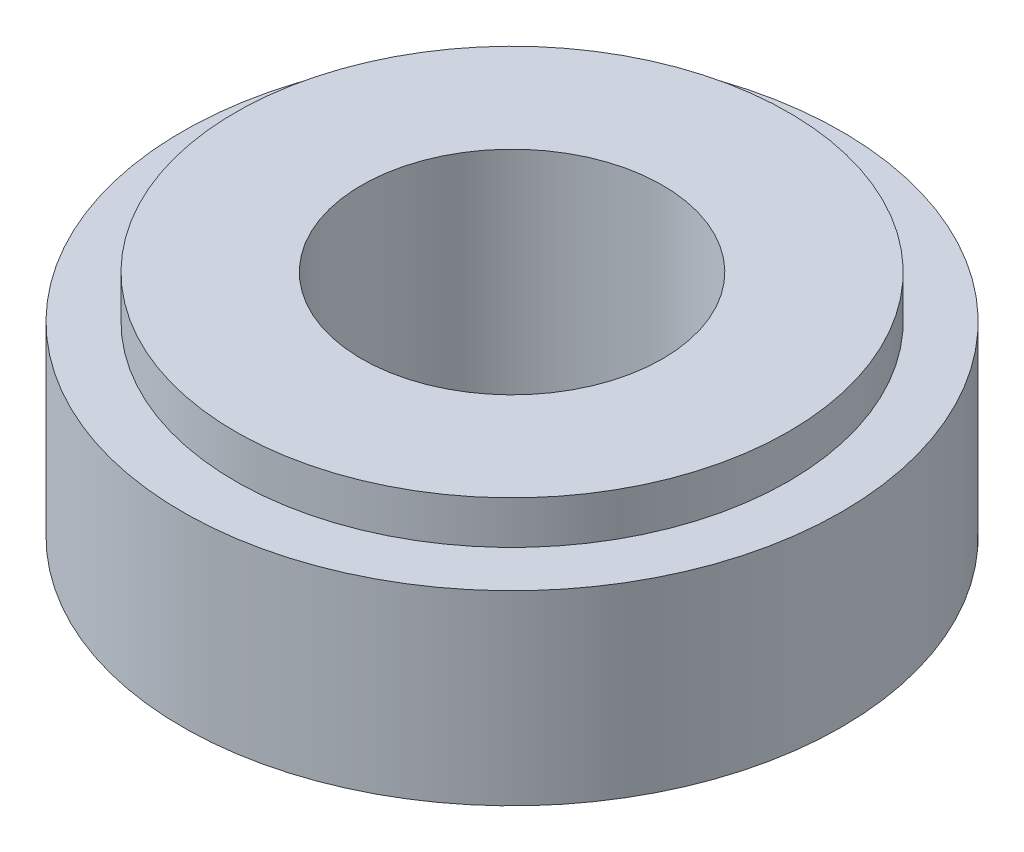
ISO-10303-21;
HEADER;
FILE_DESCRIPTION(('STEP AP214'),'2;1');
FILE_NAME('part.step','',(''),(''),'','','');
FILE_SCHEMA(('AUTOMOTIVE_DESIGN { 1 0 10303 214 1 1 1 1 }'));
ENDSEC;
DATA;
#1=APPLICATION_CONTEXT('core data for automotive mechanical design processes');
#2=APPLICATION_PROTOCOL_DEFINITION('international standard','automotive_design',2000,#1);
#3=PRODUCT_CONTEXT('',#1,'mechanical');
#4=PRODUCT('Part','Part','',(#3));
#5=PRODUCT_RELATED_PRODUCT_CATEGORY('part','',(#4));
#6=PRODUCT_DEFINITION_FORMATION('','',#4);
#7=PRODUCT_DEFINITION_CONTEXT('part definition',#1,'design');
#8=PRODUCT_DEFINITION('design','',#6,#7);
#9=PRODUCT_DEFINITION_SHAPE('','',#8);
#10=(LENGTH_UNIT() NAMED_UNIT(*) SI_UNIT(.MILLI.,.METRE.));
#11=(NAMED_UNIT(*) PLANE_ANGLE_UNIT() SI_UNIT($,.RADIAN.));
#12=(NAMED_UNIT(*) SI_UNIT($,.STERADIAN.) SOLID_ANGLE_UNIT());
#13=UNCERTAINTY_MEASURE_WITH_UNIT(LENGTH_MEASURE(1.E-05),#10,'distance_accuracy_value','');
#14=(GEOMETRIC_REPRESENTATION_CONTEXT(3) GLOBAL_UNCERTAINTY_ASSIGNED_CONTEXT((#13)) GLOBAL_UNIT_ASSIGNED_CONTEXT((#10,
#11,#12)) REPRESENTATION_CONTEXT('',''));
#15=CARTESIAN_POINT('',(0.,0.,0.));
#16=DIRECTION('',(0.,0.,1.));
#17=DIRECTION('',(1.,0.,0.));
#18=AXIS2_PLACEMENT_3D('',#15,#16,#17);
#19=CARTESIAN_POINT('',(4.34347941715535E-13,-126.622860864218,0.));
#20=DIRECTION('',(0.,-1.,0.));
#21=DIRECTION('',(1.,0.,0.));
#22=AXIS2_PLACEMENT_3D('',#19,#20,#21);
#23=CYLINDRICAL_SURFACE('',#22,5.74999999999999);
#24=CARTESIAN_POINT('',(0.,0.,0.));
#25=DIRECTION('',(0.,-1.,0.));
#26=DIRECTION('',(1.,0.,0.));
#27=AXIS2_PLACEMENT_3D('',#24,#25,#26);
#28=CIRCLE('',#27,5.75);
#29=CARTESIAN_POINT('',(5.75,0.,0.));
#30=VERTEX_POINT('',#29);
#31=EDGE_CURVE('E57',#30,#30,#28,.T.);
#32=ORIENTED_EDGE('',*,*,#31,.F.);
#33=EDGE_LOOP('',(#32));
#34=FACE_BOUND('',#33,.T.);
#35=CARTESIAN_POINT('',(0.,3.25000000000003,0.));
#36=DIRECTION('',(0.,-1.,0.));
#37=DIRECTION('',(1.,0.,0.));
#38=AXIS2_PLACEMENT_3D('',#35,#36,#37);
#39=CIRCLE('',#38,5.74999999999999);
#40=CARTESIAN_POINT('',(5.74999999999998,3.25000000000005,0.));
#41=VERTEX_POINT('',#40);
#42=EDGE_CURVE('E10',#41,#41,#39,.T.);
#43=ORIENTED_EDGE('',*,*,#42,.T.);
#44=EDGE_LOOP('',(#43));
#45=FACE_BOUND('',#44,.T.);
#46=ADVANCED_FACE('F35',(#34,#45),#23,.T.);
#47=CARTESIAN_POINT('',(-5.75,3.25,0.));
#48=DIRECTION('',(0.,-1.,0.));
#49=DIRECTION('',(1.,0.,0.));
#50=AXIS2_PLACEMENT_3D('',#47,#48,#49);
#51=PLANE('',#50);
#52=ORIENTED_EDGE('',*,*,#42,.F.);
#53=EDGE_LOOP('',(#52));
#54=FACE_BOUND('',#53,.T.);
#55=CARTESIAN_POINT('',(0.,3.25000000000003,0.));
#56=DIRECTION('',(0.,-1.,0.));
#57=DIRECTION('',(1.,0.,0.));
#58=AXIS2_PLACEMENT_3D('',#55,#56,#57);
#59=CIRCLE('',#58,4.82499999999999);
#60=CARTESIAN_POINT('',(4.82499999999998,3.25000000000005,0.));
#61=VERTEX_POINT('',#60);
#62=EDGE_CURVE('E41',#61,#61,#59,.T.);
#63=ORIENTED_EDGE('',*,*,#62,.T.);
#64=EDGE_LOOP('',(#63));
#65=FACE_BOUND('',#64,.T.);
#66=ADVANCED_FACE('F64',(#54,#65),#51,.F.);
#67=CARTESIAN_POINT('',(4.34347941715535E-13,-126.622860864218,0.));
#68=DIRECTION('',(0.,-1.,0.));
#69=DIRECTION('',(1.,0.,0.));
#70=AXIS2_PLACEMENT_3D('',#67,#68,#69);
#71=CYLINDRICAL_SURFACE('',#70,4.82499999999999);
#72=ORIENTED_EDGE('',*,*,#62,.F.);
#73=EDGE_LOOP('',(#72));
#74=FACE_BOUND('',#73,.T.);
#75=CARTESIAN_POINT('',(0.,4.00000000000003,0.));
#76=DIRECTION('',(0.,-1.,0.));
#77=DIRECTION('',(1.,0.,0.));
#78=AXIS2_PLACEMENT_3D('',#75,#76,#77);
#79=CIRCLE('',#78,4.82499999999999);
#80=CARTESIAN_POINT('',(4.82499999999997,4.00000000000005,0.));
#81=VERTEX_POINT('',#80);
#82=EDGE_CURVE('E45',#81,#81,#79,.T.);
#83=ORIENTED_EDGE('',*,*,#82,.T.);
#84=EDGE_LOOP('',(#83));
#85=FACE_BOUND('',#84,.T.);
#86=ADVANCED_FACE('F68',(#74,#85),#71,.T.);
#87=CARTESIAN_POINT('',(-4.825,4.,0.));
#88=DIRECTION('',(0.,-1.,0.));
#89=DIRECTION('',(1.,0.,0.));
#90=AXIS2_PLACEMENT_3D('',#87,#88,#89);
#91=PLANE('',#90);
#92=ORIENTED_EDGE('',*,*,#82,.F.);
#93=EDGE_LOOP('',(#92));
#94=FACE_BOUND('',#93,.T.);
#95=CARTESIAN_POINT('',(0.,4.,0.));
#96=DIRECTION('',(0.,-1.,0.));
#97=DIRECTION('',(1.,0.,0.));
#98=AXIS2_PLACEMENT_3D('',#95,#96,#97);
#99=CIRCLE('',#98,2.62499999999999);
#100=CARTESIAN_POINT('',(2.62499999999997,4.00000000000001,0.));
#101=VERTEX_POINT('',#100);
#102=EDGE_CURVE('E49',#101,#101,#99,.T.);
#103=ORIENTED_EDGE('',*,*,#102,.T.);
#104=EDGE_LOOP('',(#103));
#105=FACE_BOUND('',#104,.T.);
#106=ADVANCED_FACE('F73',(#94,#105),#91,.F.);
#107=CARTESIAN_POINT('',(4.34347941715535E-13,-126.622860864218,0.));
#108=DIRECTION('',(0.,-1.,0.));
#109=DIRECTION('',(1.,0.,0.));
#110=AXIS2_PLACEMENT_3D('',#107,#108,#109);
#111=CYLINDRICAL_SURFACE('',#110,2.62499999999999);
#112=ORIENTED_EDGE('',*,*,#102,.F.);
#113=EDGE_LOOP('',(#112));
#114=FACE_BOUND('',#113,.T.);
#115=CARTESIAN_POINT('',(0.,0.,0.));
#116=DIRECTION('',(0.,-1.,0.));
#117=DIRECTION('',(1.,0.,0.));
#118=AXIS2_PLACEMENT_3D('',#115,#116,#117);
#119=CIRCLE('',#118,2.625);
#120=CARTESIAN_POINT('',(2.625,0.,0.));
#121=VERTEX_POINT('',#120);
#122=EDGE_CURVE('E54',#121,#121,#119,.T.);
#123=ORIENTED_EDGE('',*,*,#122,.T.);
#124=EDGE_LOOP('',(#123));
#125=FACE_BOUND('',#124,.T.);
#126=ADVANCED_FACE('F79',(#114,#125),#111,.F.);
#127=CARTESIAN_POINT('',(-2.625,0.,0.));
#128=DIRECTION('',(0.,1.,0.));
#129=DIRECTION('',(-1.,0.,0.));
#130=AXIS2_PLACEMENT_3D('',#127,#128,#129);
#131=PLANE('',#130);
#132=ORIENTED_EDGE('',*,*,#122,.F.);
#133=EDGE_LOOP('',(#132));
#134=FACE_BOUND('',#133,.T.);
#135=ORIENTED_EDGE('',*,*,#31,.T.);
#136=EDGE_LOOP('',(#135));
#137=FACE_BOUND('',#136,.T.);
#138=ADVANCED_FACE('F61',(#134,#137),#131,.F.);
#139=CLOSED_SHELL('',(#46,#66,#86,#106,#126,#138));
#140=MANIFOLD_SOLID_BREP('B2',#139);
#141=ADVANCED_BREP_SHAPE_REPRESENTATION('',(#18,#140),#14);
#142=SHAPE_DEFINITION_REPRESENTATION(#9,#141);
ENDSEC;
END-ISO-10303-21;
